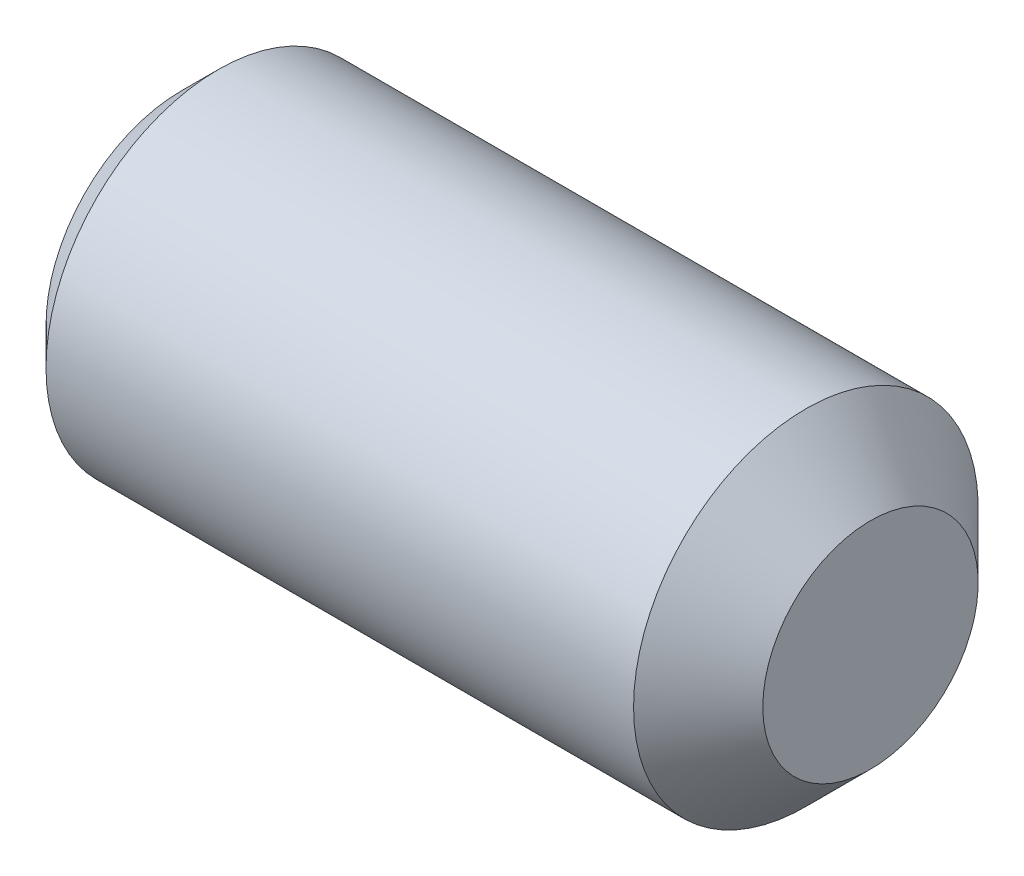
ISO-10303-21;
HEADER;
FILE_DESCRIPTION(('STEP AP214'),'2;1');
FILE_NAME('part.step','',(''),(''),'','','');
FILE_SCHEMA(('AUTOMOTIVE_DESIGN { 1 0 10303 214 1 1 1 1 }'));
ENDSEC;
DATA;
#1=APPLICATION_CONTEXT('core data for automotive mechanical design processes');
#2=APPLICATION_PROTOCOL_DEFINITION('international standard','automotive_design',2000,#1);
#3=PRODUCT_CONTEXT('',#1,'mechanical');
#4=PRODUCT('Part','Part','',(#3));
#5=PRODUCT_RELATED_PRODUCT_CATEGORY('part','',(#4));
#6=PRODUCT_DEFINITION_FORMATION('','',#4);
#7=PRODUCT_DEFINITION_CONTEXT('part definition',#1,'design');
#8=PRODUCT_DEFINITION('design','',#6,#7);
#9=PRODUCT_DEFINITION_SHAPE('','',#8);
#10=(LENGTH_UNIT() NAMED_UNIT(*) SI_UNIT(.MILLI.,.METRE.));
#11=(NAMED_UNIT(*) PLANE_ANGLE_UNIT() SI_UNIT($,.RADIAN.));
#12=(NAMED_UNIT(*) SI_UNIT($,.STERADIAN.) SOLID_ANGLE_UNIT());
#13=UNCERTAINTY_MEASURE_WITH_UNIT(LENGTH_MEASURE(1.E-05),#10,'distance_accuracy_value','');
#14=(GEOMETRIC_REPRESENTATION_CONTEXT(3) GLOBAL_UNCERTAINTY_ASSIGNED_CONTEXT((#13)) GLOBAL_UNIT_ASSIGNED_CONTEXT((#10,
#11,#12)) REPRESENTATION_CONTEXT('',''));
#15=CARTESIAN_POINT('',(0.,0.,0.));
#16=DIRECTION('',(0.,0.,1.));
#17=DIRECTION('',(1.,0.,0.));
#18=AXIS2_PLACEMENT_3D('',#15,#16,#17);
#19=CARTESIAN_POINT('',(-6.49999999999973,0.,0.));
#20=DIRECTION('',(-1.,0.,0.));
#21=DIRECTION('',(0.,0.,1.));
#22=AXIS2_PLACEMENT_3D('',#19,#20,#21);
#23=CONICAL_SURFACE('',#22,0.99999999999989,1.04716025389171);
#24=CARTESIAN_POINT('',(-5.92259999999983,0.,3.33066907387547E-13));
#25=VERTEX_POINT('',#24);
#26=VERTEX_LOOP('',#25);
#27=FACE_BOUND('',#26,.T.);
#28=CARTESIAN_POINT('',(-6.49999999999986,0.,0.));
#29=DIRECTION('',(-1.,0.,0.));
#30=DIRECTION('',(0.,0.,1.));
#31=AXIS2_PLACEMENT_3D('',#28,#29,#30);
#32=CIRCLE('',#31,1.00000000000011);
#33=CARTESIAN_POINT('',(-6.49999999999993,-0.500000000000028,0.866025403784487));
#34=VERTEX_POINT('',#33);
#35=CARTESIAN_POINT('',(-6.49999999999993,0.500000000000028,0.866025403784487));
#36=VERTEX_POINT('',#35);
#37=EDGE_CURVE('E128',#34,#36,#32,.T.);
#38=ORIENTED_EDGE('',*,*,#37,.T.);
#39=CARTESIAN_POINT('',(-6.49999999999986,0.,0.));
#40=DIRECTION('',(-1.,0.,0.));
#41=DIRECTION('',(0.,0.,1.));
#42=AXIS2_PLACEMENT_3D('',#39,#40,#41);
#43=CIRCLE('',#42,1.00000000000011);
#44=CARTESIAN_POINT('',(-6.49999999999993,1.00000000000006,0.));
#45=VERTEX_POINT('',#44);
#46=EDGE_CURVE('E172',#36,#45,#43,.T.);
#47=ORIENTED_EDGE('',*,*,#46,.T.);
#48=CARTESIAN_POINT('',(-6.49999999999986,0.,0.));
#49=DIRECTION('',(-1.,0.,0.));
#50=DIRECTION('',(0.,0.,1.));
#51=AXIS2_PLACEMENT_3D('',#48,#49,#50);
#52=CIRCLE('',#51,1.00000000000011);
#53=CARTESIAN_POINT('',(-6.49999999999993,0.500000000000028,-0.866025403784487));
#54=VERTEX_POINT('',#53);
#55=EDGE_CURVE('E158',#45,#54,#52,.T.);
#56=ORIENTED_EDGE('',*,*,#55,.T.);
#57=CARTESIAN_POINT('',(-6.49999999999986,0.,0.));
#58=DIRECTION('',(-1.,0.,0.));
#59=DIRECTION('',(0.,0.,1.));
#60=AXIS2_PLACEMENT_3D('',#57,#58,#59);
#61=CIRCLE('',#60,1.00000000000011);
#62=CARTESIAN_POINT('',(-6.49999999999993,-0.500000000000028,-0.866025403784487));
#63=VERTEX_POINT('',#62);
#64=EDGE_CURVE('E108',#54,#63,#61,.T.);
#65=ORIENTED_EDGE('',*,*,#64,.T.);
#66=CARTESIAN_POINT('',(-6.49999999999986,0.,0.));
#67=DIRECTION('',(-1.,0.,0.));
#68=DIRECTION('',(0.,0.,1.));
#69=AXIS2_PLACEMENT_3D('',#66,#67,#68);
#70=CIRCLE('',#69,1.00000000000011);
#71=CARTESIAN_POINT('',(-6.49999999999993,-1.00000000000006,0.));
#72=VERTEX_POINT('',#71);
#73=EDGE_CURVE('E19',#63,#72,#70,.T.);
#74=ORIENTED_EDGE('',*,*,#73,.T.);
#75=CARTESIAN_POINT('',(-6.49999999999986,0.,0.));
#76=DIRECTION('',(-1.,0.,0.));
#77=DIRECTION('',(0.,0.,1.));
#78=AXIS2_PLACEMENT_3D('',#75,#76,#77);
#79=CIRCLE('',#78,1.00000000000011);
#80=EDGE_CURVE('E112',#72,#34,#79,.T.);
#81=ORIENTED_EDGE('',*,*,#80,.T.);
#82=EDGE_LOOP('',(#38,#47,#56,#65,#74,#81));
#83=FACE_BOUND('',#82,.T.);
#84=ADVANCED_FACE('F16',(#27,#83),#23,.F.);
#85=CARTESIAN_POINT('',(-6.5,0.,0.));
#86=DIRECTION('',(1.,0.,0.));
#87=DIRECTION('',(0.,0.,-1.));
#88=AXIS2_PLACEMENT_3D('',#85,#86,#87);
#89=PLANE('',#88);
#90=DIRECTION('',(0.,-0.866025403784439,0.5));
#91=VECTOR('',#90,1.);
#92=CARTESIAN_POINT('',(-6.5,-1.,-0.577350269189626));
#93=LINE('',#92,#91);
#94=CARTESIAN_POINT('',(-6.5,-1.,-0.577350269189626));
#95=VERTEX_POINT('',#94);
#96=EDGE_CURVE('E133',#95,#63,#93,.F.);
#97=ORIENTED_EDGE('',*,*,#96,.F.);
#98=DIRECTION('',(0.,0.,1.));
#99=VECTOR('',#98,1.);
#100=CARTESIAN_POINT('',(-6.5,-1.,0.577350269189626));
#101=LINE('',#100,#99);
#102=EDGE_CURVE('E130',#72,#95,#101,.F.);
#103=ORIENTED_EDGE('',*,*,#102,.F.);
#104=ORIENTED_EDGE('',*,*,#73,.F.);
#105=EDGE_LOOP('',(#97,#103,#104));
#106=FACE_BOUND('',#105,.T.);
#107=ADVANCED_FACE('F131',(#106),#89,.F.);
#108=CARTESIAN_POINT('',(-6.5,0.,0.));
#109=DIRECTION('',(1.,0.,0.));
#110=DIRECTION('',(0.,0.,-1.));
#111=AXIS2_PLACEMENT_3D('',#108,#109,#110);
#112=PLANE('',#111);
#113=DIRECTION('',(0.,0.,1.));
#114=VECTOR('',#113,1.);
#115=CARTESIAN_POINT('',(-6.5,-1.,0.577350269189626));
#116=LINE('',#115,#114);
#117=CARTESIAN_POINT('',(-6.5,-1.,0.577350269189626));
#118=VERTEX_POINT('',#117);
#119=EDGE_CURVE('E122',#118,#72,#116,.F.);
#120=ORIENTED_EDGE('',*,*,#119,.F.);
#121=DIRECTION('',(0.,0.866025403784439,0.5));
#122=VECTOR('',#121,1.);
#123=CARTESIAN_POINT('',(-6.5,0.,1.15470053837925));
#124=LINE('',#123,#122);
#125=EDGE_CURVE('E125',#34,#118,#124,.F.);
#126=ORIENTED_EDGE('',*,*,#125,.F.);
#127=ORIENTED_EDGE('',*,*,#80,.F.);
#128=EDGE_LOOP('',(#120,#126,#127));
#129=FACE_BOUND('',#128,.T.);
#130=ADVANCED_FACE('F120',(#129),#112,.F.);
#131=CARTESIAN_POINT('',(-6.5,0.,0.));
#132=DIRECTION('',(1.,0.,0.));
#133=DIRECTION('',(0.,0.,-1.));
#134=AXIS2_PLACEMENT_3D('',#131,#132,#133);
#135=PLANE('',#134);
#136=DIRECTION('',(0.,0.866025403784439,0.5));
#137=VECTOR('',#136,1.);
#138=CARTESIAN_POINT('',(-6.5,0.,1.15470053837925));
#139=LINE('',#138,#137);
#140=CARTESIAN_POINT('',(-6.5,0.,1.15470053837925));
#141=VERTEX_POINT('',#140);
#142=EDGE_CURVE('E155',#141,#34,#139,.F.);
#143=ORIENTED_EDGE('',*,*,#142,.F.);
#144=DIRECTION('',(0.,0.866025403784439,-0.5));
#145=VECTOR('',#144,1.);
#146=CARTESIAN_POINT('',(-6.5,1.,0.577350269189626));
#147=LINE('',#146,#145);
#148=EDGE_CURVE('E192',#36,#141,#147,.F.);
#149=ORIENTED_EDGE('',*,*,#148,.F.);
#150=ORIENTED_EDGE('',*,*,#37,.F.);
#151=EDGE_LOOP('',(#143,#149,#150));
#152=FACE_BOUND('',#151,.T.);
#153=ADVANCED_FACE('F193',(#152),#135,.F.);
#154=CARTESIAN_POINT('',(-6.5,0.,0.));
#155=DIRECTION('',(1.,0.,0.));
#156=DIRECTION('',(0.,0.,-1.));
#157=AXIS2_PLACEMENT_3D('',#154,#155,#156);
#158=PLANE('',#157);
#159=DIRECTION('',(0.,0.866025403784439,-0.5));
#160=VECTOR('',#159,1.);
#161=CARTESIAN_POINT('',(-6.5,1.,0.577350269189626));
#162=LINE('',#161,#160);
#163=CARTESIAN_POINT('',(-6.5,1.,0.577350269189626));
#164=VERTEX_POINT('',#163);
#165=EDGE_CURVE('E186',#164,#36,#162,.F.);
#166=ORIENTED_EDGE('',*,*,#165,.F.);
#167=DIRECTION('',(0.,0.,-1.));
#168=VECTOR('',#167,1.);
#169=CARTESIAN_POINT('',(-6.5,1.,-0.577350269189625));
#170=LINE('',#169,#168);
#171=EDGE_CURVE('E189',#45,#164,#170,.F.);
#172=ORIENTED_EDGE('',*,*,#171,.F.);
#173=ORIENTED_EDGE('',*,*,#46,.F.);
#174=EDGE_LOOP('',(#166,#172,#173));
#175=FACE_BOUND('',#174,.T.);
#176=ADVANCED_FACE('F184',(#175),#158,.F.);
#177=CARTESIAN_POINT('',(-6.5,0.,0.));
#178=DIRECTION('',(1.,0.,0.));
#179=DIRECTION('',(0.,0.,-1.));
#180=AXIS2_PLACEMENT_3D('',#177,#178,#179);
#181=PLANE('',#180);
#182=DIRECTION('',(0.,-0.866025403784438,-0.5));
#183=VECTOR('',#182,1.);
#184=CARTESIAN_POINT('',(-6.5,0.,-1.15470053837925));
#185=LINE('',#184,#183);
#186=CARTESIAN_POINT('',(-6.5,0.,-1.15470053837925));
#187=VERTEX_POINT('',#186);
#188=EDGE_CURVE('E235',#187,#54,#185,.F.);
#189=ORIENTED_EDGE('',*,*,#188,.F.);
#190=DIRECTION('',(0.,-0.866025403784439,0.5));
#191=VECTOR('',#190,1.);
#192=CARTESIAN_POINT('',(-6.5,-1.,-0.577350269189626));
#193=LINE('',#192,#191);
#194=EDGE_CURVE('E144',#63,#187,#193,.F.);
#195=ORIENTED_EDGE('',*,*,#194,.F.);
#196=ORIENTED_EDGE('',*,*,#64,.F.);
#197=EDGE_LOOP('',(#189,#195,#196));
#198=FACE_BOUND('',#197,.T.);
#199=ADVANCED_FACE('F371',(#198),#181,.F.);
#200=CARTESIAN_POINT('',(-6.5,0.,0.));
#201=DIRECTION('',(1.,0.,0.));
#202=DIRECTION('',(0.,0.,-1.));
#203=AXIS2_PLACEMENT_3D('',#200,#201,#202);
#204=PLANE('',#203);
#205=DIRECTION('',(0.,0.,-1.));
#206=VECTOR('',#205,1.);
#207=CARTESIAN_POINT('',(-6.5,1.,-0.577350269189625));
#208=LINE('',#207,#206);
#209=CARTESIAN_POINT('',(-6.5,1.,-0.577350269189625));
#210=VERTEX_POINT('',#209);
#211=EDGE_CURVE('E209',#210,#45,#208,.F.);
#212=ORIENTED_EDGE('',*,*,#211,.F.);
#213=DIRECTION('',(0.,-0.866025403784438,-0.5));
#214=VECTOR('',#213,1.);
#215=CARTESIAN_POINT('',(-6.5,0.,-1.15470053837925));
#216=LINE('',#215,#214);
#217=EDGE_CURVE('E239',#54,#210,#216,.F.);
#218=ORIENTED_EDGE('',*,*,#217,.F.);
#219=ORIENTED_EDGE('',*,*,#55,.F.);
#220=EDGE_LOOP('',(#212,#218,#219));
#221=FACE_BOUND('',#220,.T.);
#222=ADVANCED_FACE('F363',(#221),#204,.F.);
#223=CARTESIAN_POINT('',(-6.5,-1.,-0.577350269189626));
#224=DIRECTION('',(0.,0.5,0.866025403784439));
#225=DIRECTION('',(0.,-0.866025403784439,0.5));
#226=AXIS2_PLACEMENT_3D('',#223,#224,#225);
#227=PLANE('',#226);
#228=ORIENTED_EDGE('',*,*,#194,.T.);
#229=DIRECTION('',(1.,0.,0.));
#230=VECTOR('',#229,1.);
#231=CARTESIAN_POINT('',(-6.5,0.,-1.15470053837925));
#232=LINE('',#231,#230);
#233=CARTESIAN_POINT('',(-8.,0.,-1.15470053837925));
#234=VERTEX_POINT('',#233);
#235=EDGE_CURVE('E240',#234,#187,#232,.T.);
#236=ORIENTED_EDGE('',*,*,#235,.F.);
#237=DIRECTION('',(0.,-0.866025403784439,0.5));
#238=VECTOR('',#237,1.);
#239=CARTESIAN_POINT('',(-8.,0.,-1.15470053837925));
#240=LINE('',#239,#238);
#241=CARTESIAN_POINT('',(-8.,-1.,-0.577350269189626));
#242=VERTEX_POINT('',#241);
#243=EDGE_CURVE('E234',#234,#242,#240,.T.);
#244=ORIENTED_EDGE('',*,*,#243,.T.);
#245=DIRECTION('',(1.,0.,0.));
#246=VECTOR('',#245,1.);
#247=CARTESIAN_POINT('',(-6.5,-1.,-0.577350269189626));
#248=LINE('',#247,#246);
#249=EDGE_CURVE('E138',#95,#242,#248,.F.);
#250=ORIENTED_EDGE('',*,*,#249,.F.);
#251=ORIENTED_EDGE('',*,*,#96,.T.);
#252=EDGE_LOOP('',(#228,#236,#244,#250,#251));
#253=FACE_BOUND('',#252,.T.);
#254=ADVANCED_FACE('F356',(#253),#227,.T.);
#255=CARTESIAN_POINT('',(-6.5,-1.,0.577350269189626));
#256=DIRECTION('',(0.,1.,0.));
#257=DIRECTION('',(0.,0.,1.));
#258=AXIS2_PLACEMENT_3D('',#255,#256,#257);
#259=PLANE('',#258);
#260=ORIENTED_EDGE('',*,*,#102,.T.);
#261=ORIENTED_EDGE('',*,*,#249,.T.);
#262=DIRECTION('',(0.,0.,-1.));
#263=VECTOR('',#262,1.);
#264=CARTESIAN_POINT('',(-8.,-1.,0.));
#265=LINE('',#264,#263);
#266=CARTESIAN_POINT('',(-8.,-1.,0.577350269189626));
#267=VERTEX_POINT('',#266);
#268=EDGE_CURVE('E228',#242,#267,#265,.F.);
#269=ORIENTED_EDGE('',*,*,#268,.T.);
#270=DIRECTION('',(1.,0.,0.));
#271=VECTOR('',#270,1.);
#272=CARTESIAN_POINT('',(-6.5,-1.,0.577350269189626));
#273=LINE('',#272,#271);
#274=EDGE_CURVE('E142',#118,#267,#273,.F.);
#275=ORIENTED_EDGE('',*,*,#274,.F.);
#276=ORIENTED_EDGE('',*,*,#119,.T.);
#277=EDGE_LOOP('',(#260,#261,#269,#275,#276));
#278=FACE_BOUND('',#277,.T.);
#279=ADVANCED_FACE('F140',(#278),#259,.T.);
#280=CARTESIAN_POINT('',(-6.5,0.,1.15470053837925));
#281=DIRECTION('',(0.,0.5,-0.866025403784439));
#282=DIRECTION('',(0.,0.866025403784439,0.5));
#283=AXIS2_PLACEMENT_3D('',#280,#281,#282);
#284=PLANE('',#283);
#285=ORIENTED_EDGE('',*,*,#125,.T.);
#286=ORIENTED_EDGE('',*,*,#274,.T.);
#287=DIRECTION('',(0.,0.866025403784439,0.5));
#288=VECTOR('',#287,1.);
#289=CARTESIAN_POINT('',(-8.,-1.,0.577350269189626));
#290=LINE('',#289,#288);
#291=CARTESIAN_POINT('',(-8.,0.,1.15470053837925));
#292=VERTEX_POINT('',#291);
#293=EDGE_CURVE('E214',#267,#292,#290,.T.);
#294=ORIENTED_EDGE('',*,*,#293,.T.);
#295=DIRECTION('',(1.,0.,0.));
#296=VECTOR('',#295,1.);
#297=CARTESIAN_POINT('',(-6.5,0.,1.15470053837925));
#298=LINE('',#297,#296);
#299=EDGE_CURVE('E197',#141,#292,#298,.F.);
#300=ORIENTED_EDGE('',*,*,#299,.F.);
#301=ORIENTED_EDGE('',*,*,#142,.T.);
#302=EDGE_LOOP('',(#285,#286,#294,#300,#301));
#303=FACE_BOUND('',#302,.T.);
#304=ADVANCED_FACE('F212',(#303),#284,.T.);
#305=CARTESIAN_POINT('',(-6.5,1.,0.577350269189626));
#306=DIRECTION('',(0.,-0.5,-0.866025403784439));
#307=DIRECTION('',(0.,0.866025403784439,-0.5));
#308=AXIS2_PLACEMENT_3D('',#305,#306,#307);
#309=PLANE('',#308);
#310=ORIENTED_EDGE('',*,*,#148,.T.);
#311=ORIENTED_EDGE('',*,*,#299,.T.);
#312=DIRECTION('',(0.,0.866025403784438,-0.5));
#313=VECTOR('',#312,1.);
#314=CARTESIAN_POINT('',(-8.,0.,1.15470053837925));
#315=LINE('',#314,#313);
#316=CARTESIAN_POINT('',(-8.,1.,0.577350269189626));
#317=VERTEX_POINT('',#316);
#318=EDGE_CURVE('E216',#292,#317,#315,.T.);
#319=ORIENTED_EDGE('',*,*,#318,.T.);
#320=DIRECTION('',(1.,0.,0.));
#321=VECTOR('',#320,1.);
#322=CARTESIAN_POINT('',(-6.5,1.,0.577350269189626));
#323=LINE('',#322,#321);
#324=EDGE_CURVE('E200',#164,#317,#323,.F.);
#325=ORIENTED_EDGE('',*,*,#324,.F.);
#326=ORIENTED_EDGE('',*,*,#165,.T.);
#327=EDGE_LOOP('',(#310,#311,#319,#325,#326));
#328=FACE_BOUND('',#327,.T.);
#329=ADVANCED_FACE('F199',(#328),#309,.T.);
#330=CARTESIAN_POINT('',(-6.5,1.,-0.577350269189625));
#331=DIRECTION('',(0.,-1.,0.));
#332=DIRECTION('',(0.,0.,-1.));
#333=AXIS2_PLACEMENT_3D('',#330,#331,#332);
#334=PLANE('',#333);
#335=ORIENTED_EDGE('',*,*,#171,.T.);
#336=ORIENTED_EDGE('',*,*,#324,.T.);
#337=DIRECTION('',(0.,0.,-1.));
#338=VECTOR('',#337,1.);
#339=CARTESIAN_POINT('',(-8.,1.,0.));
#340=LINE('',#339,#338);
#341=CARTESIAN_POINT('',(-8.,1.,-0.577350269189625));
#342=VERTEX_POINT('',#341);
#343=EDGE_CURVE('E38',#317,#342,#340,.T.);
#344=ORIENTED_EDGE('',*,*,#343,.T.);
#345=DIRECTION('',(1.,0.,0.));
#346=VECTOR('',#345,1.);
#347=CARTESIAN_POINT('',(-6.5,1.,-0.577350269189625));
#348=LINE('',#347,#346);
#349=EDGE_CURVE('E244',#210,#342,#348,.F.);
#350=ORIENTED_EDGE('',*,*,#349,.F.);
#351=ORIENTED_EDGE('',*,*,#211,.T.);
#352=EDGE_LOOP('',(#335,#336,#344,#350,#351));
#353=FACE_BOUND('',#352,.T.);
#354=ADVANCED_FACE('F256',(#353),#334,.T.);
#355=CARTESIAN_POINT('',(-6.5,0.,-1.15470053837925));
#356=DIRECTION('',(0.,-0.5,0.866025403784438));
#357=DIRECTION('',(0.,-0.866025403784438,-0.5));
#358=AXIS2_PLACEMENT_3D('',#355,#356,#357);
#359=PLANE('',#358);
#360=ORIENTED_EDGE('',*,*,#217,.T.);
#361=ORIENTED_EDGE('',*,*,#349,.T.);
#362=DIRECTION('',(0.,-0.866025403784438,-0.5));
#363=VECTOR('',#362,1.);
#364=CARTESIAN_POINT('',(-8.,1.,-0.577350269189625));
#365=LINE('',#364,#363);
#366=EDGE_CURVE('E167',#342,#234,#365,.T.);
#367=ORIENTED_EDGE('',*,*,#366,.T.);
#368=ORIENTED_EDGE('',*,*,#235,.T.);
#369=ORIENTED_EDGE('',*,*,#188,.T.);
#370=EDGE_LOOP('',(#360,#361,#367,#368,#369));
#371=FACE_BOUND('',#370,.T.);
#372=ADVANCED_FACE('F258',(#371),#359,.T.);
#373=CARTESIAN_POINT('',(0.,0.,0.));
#374=DIRECTION('',(-1.,0.,0.));
#375=DIRECTION('',(0.,0.,1.));
#376=AXIS2_PLACEMENT_3D('',#373,#374,#375);
#377=PLANE('',#376);
#378=CARTESIAN_POINT('',(0.,0.,0.));
#379=DIRECTION('',(-1.,0.,0.));
#380=DIRECTION('',(0.,0.,1.));
#381=AXIS2_PLACEMENT_3D('',#378,#379,#380);
#382=CIRCLE('',#381,1.24999999997044);
#383=CARTESIAN_POINT('',(0.,0.,1.24999999997044));
#384=VERTEX_POINT('',#383);
#385=EDGE_CURVE('E163',#384,#384,#382,.T.);
#386=ORIENTED_EDGE('',*,*,#385,.F.);
#387=EDGE_LOOP('',(#386));
#388=FACE_BOUND('',#387,.T.);
#389=ADVANCED_FACE('F265',(#388),#377,.F.);
#390=CARTESIAN_POINT('',(-8.,2.,0.));
#391=DIRECTION('',(1.,0.,0.));
#392=DIRECTION('',(0.,0.,-1.));
#393=AXIS2_PLACEMENT_3D('',#390,#391,#392);
#394=PLANE('',#393);
#395=ORIENTED_EDGE('',*,*,#343,.F.);
#396=ORIENTED_EDGE('',*,*,#318,.F.);
#397=ORIENTED_EDGE('',*,*,#293,.F.);
#398=ORIENTED_EDGE('',*,*,#268,.F.);
#399=ORIENTED_EDGE('',*,*,#243,.F.);
#400=ORIENTED_EDGE('',*,*,#366,.F.);
#401=EDGE_LOOP('',(#395,#396,#397,#398,#399,#400));
#402=FACE_BOUND('',#401,.T.);
#403=CARTESIAN_POINT('',(-7.99999999986767,0.,0.));
#404=DIRECTION('',(1.,0.,0.));
#405=DIRECTION('',(0.,1.,0.));
#406=AXIS2_PLACEMENT_3D('',#403,#404,#405);
#407=CIRCLE('',#406,1.57050000001391);
#408=CARTESIAN_POINT('',(-7.99999999986767,1.57050000001391,0.));
#409=VERTEX_POINT('',#408);
#410=EDGE_CURVE('E159',#409,#409,#407,.T.);
#411=ORIENTED_EDGE('',*,*,#410,.F.);
#412=EDGE_LOOP('',(#411));
#413=FACE_BOUND('',#412,.T.);
#414=ADVANCED_FACE('F218',(#402,#413),#394,.F.);
#415=CARTESIAN_POINT('',(-0.749999999982265,0.,0.));
#416=DIRECTION('',(-1.,0.,0.));
#417=DIRECTION('',(0.,0.,1.));
#418=AXIS2_PLACEMENT_3D('',#415,#416,#417);
#419=CONICAL_SURFACE('',#418,2.00000000000955,0.785398163435344);
#420=CARTESIAN_POINT('',(-0.749999999999999,0.,0.));
#421=DIRECTION('',(-1.,0.,0.));
#422=DIRECTION('',(0.,0.,1.));
#423=AXIS2_PLACEMENT_3D('',#420,#421,#422);
#424=CIRCLE('',#423,2.);
#425=CARTESIAN_POINT('',(-0.749999999999999,0.,2.));
#426=VERTEX_POINT('',#425);
#427=EDGE_CURVE('E26',#426,#426,#424,.T.);
#428=ORIENTED_EDGE('',*,*,#427,.F.);
#429=EDGE_LOOP('',(#428));
#430=FACE_BOUND('',#429,.T.);
#431=ORIENTED_EDGE('',*,*,#385,.T.);
#432=EDGE_LOOP('',(#431));
#433=FACE_BOUND('',#432,.T.);
#434=ADVANCED_FACE('F278',(#430,#433),#419,.T.);
#435=CARTESIAN_POINT('',(-7.57050000004256,0.,0.));
#436=DIRECTION('',(1.,0.,0.));
#437=DIRECTION('',(0.,1.,0.));
#438=AXIS2_PLACEMENT_3D('',#435,#436,#437);
#439=CONICAL_SURFACE('',#438,1.99999999989586,0.785398163463622);
#440=CARTESIAN_POINT('',(-7.5705,0.,0.));
#441=DIRECTION('',(-1.,0.,0.));
#442=DIRECTION('',(0.,0.,1.));
#443=AXIS2_PLACEMENT_3D('',#440,#441,#442);
#444=CIRCLE('',#443,2.);
#445=CARTESIAN_POINT('',(-7.5705,0.,2.));
#446=VERTEX_POINT('',#445);
#447=EDGE_CURVE('E11',#446,#446,#444,.F.);
#448=ORIENTED_EDGE('',*,*,#447,.F.);
#449=EDGE_LOOP('',(#448));
#450=FACE_BOUND('',#449,.T.);
#451=ORIENTED_EDGE('',*,*,#410,.T.);
#452=EDGE_LOOP('',(#451));
#453=FACE_BOUND('',#452,.T.);
#454=ADVANCED_FACE('F271',(#450,#453),#439,.T.);
#455=CARTESIAN_POINT('',(-6.64232706944173,0.,0.));
#456=DIRECTION('',(-1.,0.,0.));
#457=DIRECTION('',(0.,0.,1.));
#458=AXIS2_PLACEMENT_3D('',#455,#456,#457);
#459=CYLINDRICAL_SURFACE('',#458,2.);
#460=ORIENTED_EDGE('',*,*,#447,.T.);
#461=EDGE_LOOP('',(#460));
#462=FACE_BOUND('',#461,.T.);
#463=ORIENTED_EDGE('',*,*,#427,.T.);
#464=EDGE_LOOP('',(#463));
#465=FACE_BOUND('',#464,.T.);
#466=ADVANCED_FACE('F269',(#462,#465),#459,.T.);
#467=CLOSED_SHELL('',(#84,#107,#130,#153,#176,#199,#222,#254,#279,#304,#329,#354,#372,#389,#414,
#434,#454,#466));
#468=MANIFOLD_SOLID_BREP('B1',#467);
#469=ADVANCED_BREP_SHAPE_REPRESENTATION('',(#18,#468),#14);
#470=SHAPE_DEFINITION_REPRESENTATION(#9,#469);
ENDSEC;
END-ISO-10303-21;
